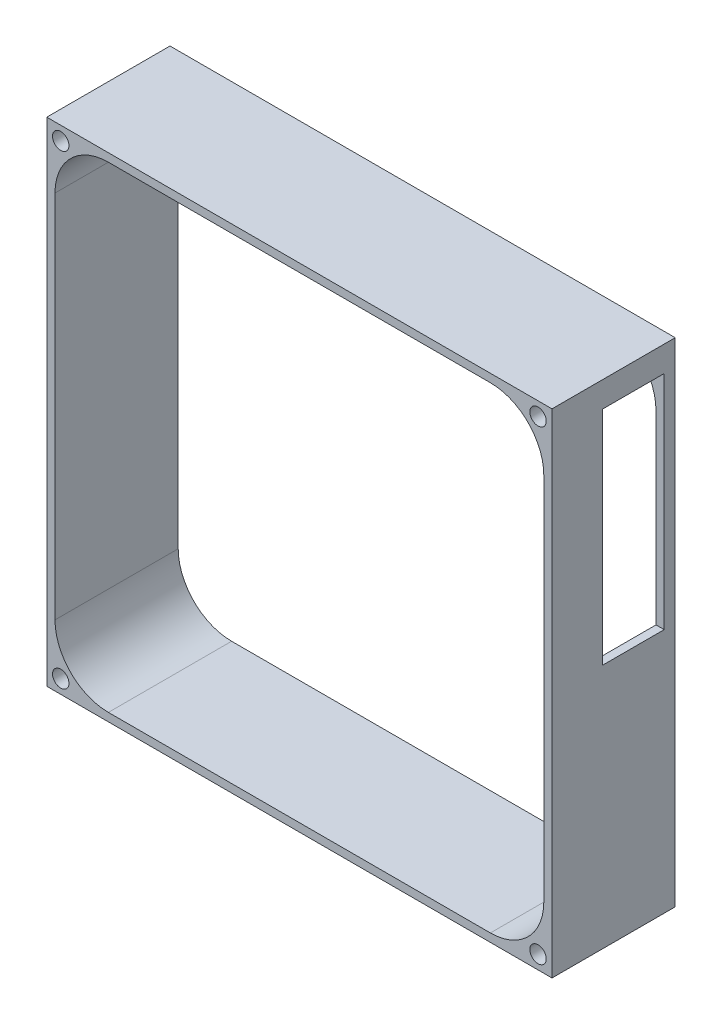
ISO-10303-21;
HEADER;
FILE_DESCRIPTION(('STEP AP214'),'2;1');
FILE_NAME('part.step','',(''),(''),'','','');
FILE_SCHEMA(('AUTOMOTIVE_DESIGN { 1 0 10303 214 1 1 1 1 }'));
ENDSEC;
DATA;
#1=APPLICATION_CONTEXT('core data for automotive mechanical design processes');
#2=APPLICATION_PROTOCOL_DEFINITION('international standard','automotive_design',2000,#1);
#3=PRODUCT_CONTEXT('',#1,'mechanical');
#4=PRODUCT('Part','Part','',(#3));
#5=PRODUCT_RELATED_PRODUCT_CATEGORY('part','',(#4));
#6=PRODUCT_DEFINITION_FORMATION('','',#4);
#7=PRODUCT_DEFINITION_CONTEXT('part definition',#1,'design');
#8=PRODUCT_DEFINITION('design','',#6,#7);
#9=PRODUCT_DEFINITION_SHAPE('','',#8);
#10=(LENGTH_UNIT() NAMED_UNIT(*) SI_UNIT(.MILLI.,.METRE.));
#11=(NAMED_UNIT(*) PLANE_ANGLE_UNIT() SI_UNIT($,.RADIAN.));
#12=(NAMED_UNIT(*) SI_UNIT($,.STERADIAN.) SOLID_ANGLE_UNIT());
#13=UNCERTAINTY_MEASURE_WITH_UNIT(LENGTH_MEASURE(1.E-05),#10,'distance_accuracy_value','');
#14=(GEOMETRIC_REPRESENTATION_CONTEXT(3) GLOBAL_UNCERTAINTY_ASSIGNED_CONTEXT((#13)) GLOBAL_UNIT_ASSIGNED_CONTEXT((#10,
#11,#12)) REPRESENTATION_CONTEXT('',''));
#15=CARTESIAN_POINT('',(0.,0.,0.));
#16=DIRECTION('',(0.,0.,1.));
#17=DIRECTION('',(1.,0.,0.));
#18=AXIS2_PLACEMENT_3D('',#15,#16,#17);
#19=CARTESIAN_POINT('',(0.,0.,30.));
#20=DIRECTION('',(0.,0.,1.));
#21=DIRECTION('',(1.,0.,0.));
#22=AXIS2_PLACEMENT_3D('',#19,#20,#21);
#23=PLANE('',#22);
#24=CARTESIAN_POINT('',(32.1945356443295,-3.47882005527365,30.));
#25=DIRECTION('',(0.,0.,1.));
#26=DIRECTION('',(1.,0.,0.));
#27=AXIS2_PLACEMENT_3D('',#24,#25,#26);
#28=CIRCLE('',#27,2.);
#29=CARTESIAN_POINT('',(34.1945356443295,-3.47882005527365,30.));
#30=VERTEX_POINT('',#29);
#31=EDGE_CURVE('E290',#30,#30,#28,.T.);
#32=ORIENTED_EDGE('',*,*,#31,.F.);
#33=EDGE_LOOP('',(#32));
#34=FACE_BOUND('',#33,.T.);
#35=CARTESIAN_POINT('',(-84.0083880507575,109.894431899334,30.));
#36=DIRECTION('',(0.,0.,1.));
#37=DIRECTION('',(1.,0.,0.));
#38=AXIS2_PLACEMENT_3D('',#35,#36,#37);
#39=CIRCLE('',#38,2.);
#40=CARTESIAN_POINT('',(-82.0083880507575,109.894431899334,30.));
#41=VERTEX_POINT('',#40);
#42=EDGE_CURVE('E302',#41,#41,#39,.T.);
#43=ORIENTED_EDGE('',*,*,#42,.F.);
#44=EDGE_LOOP('',(#43));
#45=FACE_BOUND('',#44,.T.);
#46=DIRECTION('',(0.,-1.,0.));
#47=VECTOR('',#46,1.);
#48=CARTESIAN_POINT('',(-87.406926203214,113.20780592203,30.));
#49=LINE('',#48,#47);
#50=CARTESIAN_POINT('',(-87.406926203214,113.20780592203,30.));
#51=VERTEX_POINT('',#50);
#52=CARTESIAN_POINT('',(-87.406926203214,-6.79219407796985,30.));
#53=VERTEX_POINT('',#52);
#54=EDGE_CURVE('E308',#51,#53,#49,.T.);
#55=ORIENTED_EDGE('',*,*,#54,.T.);
#56=DIRECTION('',(1.,0.,0.));
#57=VECTOR('',#56,1.);
#58=CARTESIAN_POINT('',(-87.406926203214,-6.79219407796985,30.));
#59=LINE('',#58,#57);
#60=CARTESIAN_POINT('',(35.593073796786,-6.79219407796985,30.));
#61=VERTEX_POINT('',#60);
#62=EDGE_CURVE('E311',#53,#61,#59,.T.);
#63=ORIENTED_EDGE('',*,*,#62,.T.);
#64=DIRECTION('',(0.,1.,0.));
#65=VECTOR('',#64,1.);
#66=CARTESIAN_POINT('',(35.593073796786,113.20780592203,30.));
#67=LINE('',#66,#65);
#68=CARTESIAN_POINT('',(35.593073796786,113.20780592203,30.));
#69=VERTEX_POINT('',#68);
#70=EDGE_CURVE('E314',#61,#69,#67,.T.);
#71=ORIENTED_EDGE('',*,*,#70,.T.);
#72=DIRECTION('',(-1.,0.,0.));
#73=VECTOR('',#72,1.);
#74=CARTESIAN_POINT('',(-87.406926203214,113.20780592203,30.));
#75=LINE('',#74,#73);
#76=EDGE_CURVE('E316',#69,#51,#75,.T.);
#77=ORIENTED_EDGE('',*,*,#76,.T.);
#78=EDGE_LOOP('',(#55,#63,#71,#77));
#79=FACE_BOUND('',#78,.T.);
#80=CARTESIAN_POINT('',(32.1945356443295,109.894431899334,30.));
#81=DIRECTION('',(0.,0.,1.));
#82=DIRECTION('',(-1.,0.,0.));
#83=AXIS2_PLACEMENT_3D('',#80,#81,#82);
#84=CIRCLE('',#83,2.);
#85=CARTESIAN_POINT('',(30.1945356443295,109.894431899334,30.));
#86=VERTEX_POINT('',#85);
#87=EDGE_CURVE('E296',#86,#86,#84,.T.);
#88=ORIENTED_EDGE('',*,*,#87,.F.);
#89=EDGE_LOOP('',(#88));
#90=FACE_BOUND('',#89,.T.);
#91=CARTESIAN_POINT('',(-84.0083880507575,-3.47882005527365,30.));
#92=DIRECTION('',(0.,0.,1.));
#93=DIRECTION('',(-1.,0.,0.));
#94=AXIS2_PLACEMENT_3D('',#91,#92,#93);
#95=CIRCLE('',#94,2.);
#96=CARTESIAN_POINT('',(-86.0083880507575,-3.47882005527365,30.));
#97=VERTEX_POINT('',#96);
#98=EDGE_CURVE('E284',#97,#97,#95,.T.);
#99=ORIENTED_EDGE('',*,*,#98,.F.);
#100=EDGE_LOOP('',(#99));
#101=FACE_BOUND('',#100,.T.);
#102=DIRECTION('',(1.,0.,0.));
#103=VECTOR('',#102,1.);
#104=CARTESIAN_POINT('',(-72.406926203214,-4.79219407796985,30.));
#105=LINE('',#104,#103);
#106=CARTESIAN_POINT('',(-72.406926203214,-4.79219407796985,30.));
#107=VERTEX_POINT('',#106);
#108=CARTESIAN_POINT('',(20.593073796786,-4.79219407796988,30.));
#109=VERTEX_POINT('',#108);
#110=EDGE_CURVE('E225',#107,#109,#105,.T.);
#111=ORIENTED_EDGE('',*,*,#110,.F.);
#112=CARTESIAN_POINT('',(-72.406926203214,8.20780592203015,30.));
#113=DIRECTION('',(0.,0.,1.));
#114=DIRECTION('',(1.,0.,0.));
#115=AXIS2_PLACEMENT_3D('',#112,#113,#114);
#116=CIRCLE('',#115,13.);
#117=CARTESIAN_POINT('',(-85.4069262032141,8.20780592203015,30.));
#118=VERTEX_POINT('',#117);
#119=EDGE_CURVE('E223',#118,#107,#116,.T.);
#120=ORIENTED_EDGE('',*,*,#119,.F.);
#121=DIRECTION('',(0.,-1.,0.));
#122=VECTOR('',#121,1.);
#123=CARTESIAN_POINT('',(-85.4069262032141,98.2078059220301,30.));
#124=LINE('',#123,#122);
#125=CARTESIAN_POINT('',(-85.4069262032141,98.2078059220301,30.));
#126=VERTEX_POINT('',#125);
#127=EDGE_CURVE('E239',#126,#118,#124,.T.);
#128=ORIENTED_EDGE('',*,*,#127,.F.);
#129=CARTESIAN_POINT('',(-72.406926203214,98.2078059220301,30.));
#130=DIRECTION('',(0.,0.,1.));
#131=DIRECTION('',(1.,0.,0.));
#132=AXIS2_PLACEMENT_3D('',#129,#130,#131);
#133=CIRCLE('',#132,13.);
#134=CARTESIAN_POINT('',(-72.406926203214,111.20780592203,30.));
#135=VERTEX_POINT('',#134);
#136=EDGE_CURVE('E236',#135,#126,#133,.T.);
#137=ORIENTED_EDGE('',*,*,#136,.F.);
#138=DIRECTION('',(-1.,0.,0.));
#139=VECTOR('',#138,1.);
#140=CARTESIAN_POINT('',(-72.406926203214,111.20780592203,30.));
#141=LINE('',#140,#139);
#142=CARTESIAN_POINT('',(20.593073796786,111.20780592203,30.));
#143=VERTEX_POINT('',#142);
#144=EDGE_CURVE('E234',#143,#135,#141,.T.);
#145=ORIENTED_EDGE('',*,*,#144,.F.);
#146=CARTESIAN_POINT('',(20.593073796786,98.2078059220301,30.));
#147=DIRECTION('',(0.,0.,1.));
#148=DIRECTION('',(1.,0.,0.));
#149=AXIS2_PLACEMENT_3D('',#146,#147,#148);
#150=CIRCLE('',#149,13.);
#151=CARTESIAN_POINT('',(33.593073796786,98.2078059220301,30.));
#152=VERTEX_POINT('',#151);
#153=EDGE_CURVE('E232',#152,#143,#150,.T.);
#154=ORIENTED_EDGE('',*,*,#153,.F.);
#155=DIRECTION('',(0.,1.,0.));
#156=VECTOR('',#155,1.);
#157=CARTESIAN_POINT('',(33.5930737967861,98.2078059220301,30.));
#158=LINE('',#157,#156);
#159=CARTESIAN_POINT('',(33.5930737967861,8.20780592203015,30.));
#160=VERTEX_POINT('',#159);
#161=EDGE_CURVE('E230',#160,#152,#158,.T.);
#162=ORIENTED_EDGE('',*,*,#161,.F.);
#163=CARTESIAN_POINT('',(20.593073796786,8.20780592203015,30.));
#164=DIRECTION('',(0.,0.,1.));
#165=DIRECTION('',(1.,0.,0.));
#166=AXIS2_PLACEMENT_3D('',#163,#164,#165);
#167=CIRCLE('',#166,13.);
#168=EDGE_CURVE('E228',#109,#160,#167,.T.);
#169=ORIENTED_EDGE('',*,*,#168,.F.);
#170=EDGE_LOOP('',(#111,#120,#128,#137,#145,#154,#162,#169));
#171=FACE_BOUND('',#170,.T.);
#172=ADVANCED_FACE('F35',(#34,#45,#79,#90,#101,#171),#23,.T.);
#173=CARTESIAN_POINT('',(0.,0.,0.));
#174=DIRECTION('',(0.,0.,1.));
#175=DIRECTION('',(1.,0.,0.));
#176=AXIS2_PLACEMENT_3D('',#173,#174,#175);
#177=PLANE('',#176);
#178=CARTESIAN_POINT('',(-84.0083880507575,-3.47882005527365,0.));
#179=DIRECTION('',(0.,0.,1.));
#180=DIRECTION('',(-1.,0.,0.));
#181=AXIS2_PLACEMENT_3D('',#178,#179,#180);
#182=CIRCLE('',#181,2.);
#183=CARTESIAN_POINT('',(-86.0083880507575,-3.47882005527365,0.));
#184=VERTEX_POINT('',#183);
#185=EDGE_CURVE('E283',#184,#184,#182,.T.);
#186=ORIENTED_EDGE('',*,*,#185,.T.);
#187=EDGE_LOOP('',(#186));
#188=FACE_BOUND('',#187,.T.);
#189=CARTESIAN_POINT('',(32.1945356443295,-3.47882005527365,0.));
#190=DIRECTION('',(0.,0.,1.));
#191=DIRECTION('',(1.,0.,0.));
#192=AXIS2_PLACEMENT_3D('',#189,#190,#191);
#193=CIRCLE('',#192,2.);
#194=CARTESIAN_POINT('',(34.1945356443295,-3.47882005527365,0.));
#195=VERTEX_POINT('',#194);
#196=EDGE_CURVE('E287',#195,#195,#193,.T.);
#197=ORIENTED_EDGE('',*,*,#196,.T.);
#198=EDGE_LOOP('',(#197));
#199=FACE_BOUND('',#198,.T.);
#200=CARTESIAN_POINT('',(32.1945356443295,109.894431899334,0.));
#201=DIRECTION('',(0.,0.,1.));
#202=DIRECTION('',(-1.,0.,0.));
#203=AXIS2_PLACEMENT_3D('',#200,#201,#202);
#204=CIRCLE('',#203,2.);
#205=CARTESIAN_POINT('',(30.1945356443295,109.894431899334,0.));
#206=VERTEX_POINT('',#205);
#207=EDGE_CURVE('E293',#206,#206,#204,.T.);
#208=ORIENTED_EDGE('',*,*,#207,.T.);
#209=EDGE_LOOP('',(#208));
#210=FACE_BOUND('',#209,.T.);
#211=CARTESIAN_POINT('',(-84.0083880507575,109.894431899334,0.));
#212=DIRECTION('',(0.,0.,1.));
#213=DIRECTION('',(1.,0.,0.));
#214=AXIS2_PLACEMENT_3D('',#211,#212,#213);
#215=CIRCLE('',#214,2.);
#216=CARTESIAN_POINT('',(-82.0083880507575,109.894431899334,0.));
#217=VERTEX_POINT('',#216);
#218=EDGE_CURVE('E299',#217,#217,#215,.T.);
#219=ORIENTED_EDGE('',*,*,#218,.T.);
#220=EDGE_LOOP('',(#219));
#221=FACE_BOUND('',#220,.T.);
#222=DIRECTION('',(0.,-1.,0.));
#223=VECTOR('',#222,1.);
#224=CARTESIAN_POINT('',(-87.406926203214,113.20780592203,0.));
#225=LINE('',#224,#223);
#226=CARTESIAN_POINT('',(-87.406926203214,113.20780592203,0.));
#227=VERTEX_POINT('',#226);
#228=CARTESIAN_POINT('',(-87.406926203214,-6.79219407796985,0.));
#229=VERTEX_POINT('',#228);
#230=EDGE_CURVE('E305',#227,#229,#225,.T.);
#231=ORIENTED_EDGE('',*,*,#230,.F.);
#232=DIRECTION('',(-1.,0.,0.));
#233=VECTOR('',#232,1.);
#234=CARTESIAN_POINT('',(-87.406926203214,113.20780592203,0.));
#235=LINE('',#234,#233);
#236=CARTESIAN_POINT('',(35.593073796786,113.20780592203,0.));
#237=VERTEX_POINT('',#236);
#238=EDGE_CURVE('E312',#237,#227,#235,.T.);
#239=ORIENTED_EDGE('',*,*,#238,.F.);
#240=DIRECTION('',(0.,1.,0.));
#241=VECTOR('',#240,1.);
#242=CARTESIAN_POINT('',(35.593073796786,113.20780592203,0.));
#243=LINE('',#242,#241);
#244=CARTESIAN_POINT('',(35.593073796786,-6.79219407796985,0.));
#245=VERTEX_POINT('',#244);
#246=EDGE_CURVE('E323',#245,#237,#243,.T.);
#247=ORIENTED_EDGE('',*,*,#246,.F.);
#248=DIRECTION('',(1.,0.,0.));
#249=VECTOR('',#248,1.);
#250=CARTESIAN_POINT('',(-87.406926203214,-6.79219407796985,0.));
#251=LINE('',#250,#249);
#252=EDGE_CURVE('E321',#229,#245,#251,.T.);
#253=ORIENTED_EDGE('',*,*,#252,.F.);
#254=EDGE_LOOP('',(#231,#239,#247,#253));
#255=FACE_BOUND('',#254,.T.);
#256=CARTESIAN_POINT('',(-72.406926203214,8.20780592203015,0.));
#257=DIRECTION('',(0.,0.,1.));
#258=DIRECTION('',(1.,0.,0.));
#259=AXIS2_PLACEMENT_3D('',#256,#257,#258);
#260=CIRCLE('',#259,13.);
#261=CARTESIAN_POINT('',(-85.4069262032141,8.20780592203015,0.));
#262=VERTEX_POINT('',#261);
#263=CARTESIAN_POINT('',(-72.406926203214,-4.79219407796985,0.));
#264=VERTEX_POINT('',#263);
#265=EDGE_CURVE('E222',#262,#264,#260,.T.);
#266=ORIENTED_EDGE('',*,*,#265,.T.);
#267=DIRECTION('',(1.,0.,0.));
#268=VECTOR('',#267,1.);
#269=CARTESIAN_POINT('',(-72.406926203214,-4.79219407796985,0.));
#270=LINE('',#269,#268);
#271=CARTESIAN_POINT('',(20.593073796786,-4.79219407796988,0.));
#272=VERTEX_POINT('',#271);
#273=EDGE_CURVE('E244',#264,#272,#270,.T.);
#274=ORIENTED_EDGE('',*,*,#273,.T.);
#275=CARTESIAN_POINT('',(20.593073796786,8.20780592203015,0.));
#276=DIRECTION('',(0.,0.,1.));
#277=DIRECTION('',(1.,0.,0.));
#278=AXIS2_PLACEMENT_3D('',#275,#276,#277);
#279=CIRCLE('',#278,13.);
#280=CARTESIAN_POINT('',(33.5930737967861,8.20780592203015,0.));
#281=VERTEX_POINT('',#280);
#282=EDGE_CURVE('E247',#272,#281,#279,.T.);
#283=ORIENTED_EDGE('',*,*,#282,.T.);
#284=DIRECTION('',(0.,1.,0.));
#285=VECTOR('',#284,1.);
#286=CARTESIAN_POINT('',(33.5930737967861,98.2078059220301,0.));
#287=LINE('',#286,#285);
#288=CARTESIAN_POINT('',(33.593073796786,98.2078059220301,0.));
#289=VERTEX_POINT('',#288);
#290=EDGE_CURVE('E250',#281,#289,#287,.T.);
#291=ORIENTED_EDGE('',*,*,#290,.T.);
#292=CARTESIAN_POINT('',(20.593073796786,98.2078059220301,0.));
#293=DIRECTION('',(0.,0.,1.));
#294=DIRECTION('',(1.,0.,0.));
#295=AXIS2_PLACEMENT_3D('',#292,#293,#294);
#296=CIRCLE('',#295,13.);
#297=CARTESIAN_POINT('',(20.593073796786,111.20780592203,0.));
#298=VERTEX_POINT('',#297);
#299=EDGE_CURVE('E253',#289,#298,#296,.T.);
#300=ORIENTED_EDGE('',*,*,#299,.T.);
#301=DIRECTION('',(-1.,0.,0.));
#302=VECTOR('',#301,1.);
#303=CARTESIAN_POINT('',(-72.406926203214,111.20780592203,0.));
#304=LINE('',#303,#302);
#305=CARTESIAN_POINT('',(-72.406926203214,111.20780592203,0.));
#306=VERTEX_POINT('',#305);
#307=EDGE_CURVE('E256',#298,#306,#304,.T.);
#308=ORIENTED_EDGE('',*,*,#307,.T.);
#309=CARTESIAN_POINT('',(-72.406926203214,98.2078059220301,0.));
#310=DIRECTION('',(0.,0.,1.));
#311=DIRECTION('',(1.,0.,0.));
#312=AXIS2_PLACEMENT_3D('',#309,#310,#311);
#313=CIRCLE('',#312,13.);
#314=CARTESIAN_POINT('',(-85.4069262032141,98.2078059220301,0.));
#315=VERTEX_POINT('',#314);
#316=EDGE_CURVE('E259',#306,#315,#313,.T.);
#317=ORIENTED_EDGE('',*,*,#316,.T.);
#318=DIRECTION('',(0.,-1.,0.));
#319=VECTOR('',#318,1.);
#320=CARTESIAN_POINT('',(-85.4069262032141,98.2078059220301,0.));
#321=LINE('',#320,#319);
#322=EDGE_CURVE('E226',#315,#262,#321,.T.);
#323=ORIENTED_EDGE('',*,*,#322,.T.);
#324=EDGE_LOOP('',(#266,#274,#283,#291,#300,#308,#317,#323));
#325=FACE_BOUND('',#324,.T.);
#326=ADVANCED_FACE('F357',(#188,#199,#210,#221,#255,#325),#177,.F.);
#327=CARTESIAN_POINT('',(-87.406926203214,113.20780592203,30.));
#328=DIRECTION('',(1.,0.,0.));
#329=DIRECTION('',(0.,0.,-1.));
#330=AXIS2_PLACEMENT_3D('',#327,#328,#329);
#331=PLANE('',#330);
#332=ORIENTED_EDGE('',*,*,#230,.T.);
#333=DIRECTION('',(0.,0.,-1.));
#334=VECTOR('',#333,1.);
#335=CARTESIAN_POINT('',(-87.406926203214,-6.79219407796985,30.));
#336=LINE('',#335,#334);
#337=EDGE_CURVE('E334',#53,#229,#336,.T.);
#338=ORIENTED_EDGE('',*,*,#337,.F.);
#339=ORIENTED_EDGE('',*,*,#54,.F.);
#340=DIRECTION('',(0.,0.,-1.));
#341=VECTOR('',#340,1.);
#342=CARTESIAN_POINT('',(-87.406926203214,113.20780592203,30.));
#343=LINE('',#342,#341);
#344=EDGE_CURVE('E318',#51,#227,#343,.T.);
#345=ORIENTED_EDGE('',*,*,#344,.T.);
#346=EDGE_LOOP('',(#332,#338,#339,#345));
#347=FACE_BOUND('',#346,.T.);
#348=ADVANCED_FACE('F37',(#347),#331,.F.);
#349=CARTESIAN_POINT('',(-87.406926203214,-6.79219407796985,30.));
#350=DIRECTION('',(0.,1.,0.));
#351=DIRECTION('',(0.,0.,1.));
#352=AXIS2_PLACEMENT_3D('',#349,#350,#351);
#353=PLANE('',#352);
#354=ORIENTED_EDGE('',*,*,#252,.T.);
#355=DIRECTION('',(0.,0.,-1.));
#356=VECTOR('',#355,1.);
#357=CARTESIAN_POINT('',(35.593073796786,-6.79219407796985,30.));
#358=LINE('',#357,#356);
#359=EDGE_CURVE('E331',#61,#245,#358,.T.);
#360=ORIENTED_EDGE('',*,*,#359,.F.);
#361=ORIENTED_EDGE('',*,*,#62,.F.);
#362=ORIENTED_EDGE('',*,*,#337,.T.);
#363=EDGE_LOOP('',(#354,#360,#361,#362));
#364=FACE_BOUND('',#363,.T.);
#365=ADVANCED_FACE('F437',(#364),#353,.F.);
#366=CARTESIAN_POINT('',(35.593073796786,113.20780592203,30.));
#367=DIRECTION('',(-1.,0.,0.));
#368=DIRECTION('',(0.,-1.,0.));
#369=AXIS2_PLACEMENT_3D('',#366,#367,#368);
#370=PLANE('',#369);
#371=DIRECTION('',(0.,0.,-1.));
#372=VECTOR('',#371,1.);
#373=CARTESIAN_POINT('',(35.593073796786,52.9993054888305,17.6862832316964));
#374=LINE('',#373,#372);
#375=CARTESIAN_POINT('',(35.593073796786,52.9993054888305,17.6862832316964));
#376=VERTEX_POINT('',#375);
#377=CARTESIAN_POINT('',(35.593073796786,52.9993054888305,2.68628323169639));
#378=VERTEX_POINT('',#377);
#379=EDGE_CURVE('E202',#376,#378,#374,.T.);
#380=ORIENTED_EDGE('',*,*,#379,.F.);
#381=DIRECTION('',(0.,-1.,0.));
#382=VECTOR('',#381,1.);
#383=CARTESIAN_POINT('',(35.593073796786,106.99930548883,17.6862832316964));
#384=LINE('',#383,#382);
#385=CARTESIAN_POINT('',(35.593073796786,106.99930548883,17.6862832316964));
#386=VERTEX_POINT('',#385);
#387=EDGE_CURVE('E50',#386,#376,#384,.T.);
#388=ORIENTED_EDGE('',*,*,#387,.F.);
#389=DIRECTION('',(0.,0.,1.));
#390=VECTOR('',#389,1.);
#391=CARTESIAN_POINT('',(35.593073796786,106.99930548883,17.6862832316964));
#392=LINE('',#391,#390);
#393=CARTESIAN_POINT('',(35.593073796786,106.99930548883,2.68628323169639));
#394=VERTEX_POINT('',#393);
#395=EDGE_CURVE('E207',#394,#386,#392,.T.);
#396=ORIENTED_EDGE('',*,*,#395,.F.);
#397=DIRECTION('',(0.,1.,0.));
#398=VECTOR('',#397,1.);
#399=CARTESIAN_POINT('',(35.593073796786,106.99930548883,2.68628323169639));
#400=LINE('',#399,#398);
#401=EDGE_CURVE('E205',#378,#394,#400,.T.);
#402=ORIENTED_EDGE('',*,*,#401,.F.);
#403=EDGE_LOOP('',(#380,#388,#396,#402));
#404=FACE_BOUND('',#403,.T.);
#405=ORIENTED_EDGE('',*,*,#246,.T.);
#406=DIRECTION('',(0.,0.,-1.));
#407=VECTOR('',#406,1.);
#408=CARTESIAN_POINT('',(35.593073796786,113.20780592203,30.));
#409=LINE('',#408,#407);
#410=EDGE_CURVE('E328',#69,#237,#409,.T.);
#411=ORIENTED_EDGE('',*,*,#410,.F.);
#412=ORIENTED_EDGE('',*,*,#70,.F.);
#413=ORIENTED_EDGE('',*,*,#359,.T.);
#414=EDGE_LOOP('',(#405,#411,#412,#413));
#415=FACE_BOUND('',#414,.T.);
#416=ADVANCED_FACE('F402',(#404,#415),#370,.F.);
#417=CARTESIAN_POINT('',(-87.406926203214,113.20780592203,30.));
#418=DIRECTION('',(0.,-1.,0.));
#419=DIRECTION('',(0.,0.,-1.));
#420=AXIS2_PLACEMENT_3D('',#417,#418,#419);
#421=PLANE('',#420);
#422=ORIENTED_EDGE('',*,*,#238,.T.);
#423=ORIENTED_EDGE('',*,*,#344,.F.);
#424=ORIENTED_EDGE('',*,*,#76,.F.);
#425=ORIENTED_EDGE('',*,*,#410,.T.);
#426=EDGE_LOOP('',(#422,#423,#424,#425));
#427=FACE_BOUND('',#426,.T.);
#428=ADVANCED_FACE('F432',(#427),#421,.F.);
#429=CARTESIAN_POINT('',(-84.0083880507575,109.894431899334,30.));
#430=DIRECTION('',(0.,0.,-1.));
#431=DIRECTION('',(-1.,0.,0.));
#432=AXIS2_PLACEMENT_3D('',#429,#430,#431);
#433=CYLINDRICAL_SURFACE('',#432,2.);
#434=ORIENTED_EDGE('',*,*,#42,.T.);
#435=EDGE_LOOP('',(#434));
#436=FACE_BOUND('',#435,.T.);
#437=ORIENTED_EDGE('',*,*,#218,.F.);
#438=EDGE_LOOP('',(#437));
#439=FACE_BOUND('',#438,.T.);
#440=ADVANCED_FACE('F429',(#436,#439),#433,.F.);
#441=CARTESIAN_POINT('',(32.1945356443295,109.894431899334,30.));
#442=DIRECTION('',(0.,0.,-1.));
#443=DIRECTION('',(-1.,0.,0.));
#444=AXIS2_PLACEMENT_3D('',#441,#442,#443);
#445=CYLINDRICAL_SURFACE('',#444,2.);
#446=ORIENTED_EDGE('',*,*,#87,.T.);
#447=EDGE_LOOP('',(#446));
#448=FACE_BOUND('',#447,.T.);
#449=ORIENTED_EDGE('',*,*,#207,.F.);
#450=EDGE_LOOP('',(#449));
#451=FACE_BOUND('',#450,.T.);
#452=ADVANCED_FACE('F475',(#448,#451),#445,.F.);
#453=CARTESIAN_POINT('',(32.1945356443295,-3.47882005527365,30.));
#454=DIRECTION('',(0.,0.,-1.));
#455=DIRECTION('',(-1.,0.,0.));
#456=AXIS2_PLACEMENT_3D('',#453,#454,#455);
#457=CYLINDRICAL_SURFACE('',#456,2.);
#458=ORIENTED_EDGE('',*,*,#31,.T.);
#459=EDGE_LOOP('',(#458));
#460=FACE_BOUND('',#459,.T.);
#461=ORIENTED_EDGE('',*,*,#196,.F.);
#462=EDGE_LOOP('',(#461));
#463=FACE_BOUND('',#462,.T.);
#464=ADVANCED_FACE('F464',(#460,#463),#457,.F.);
#465=CARTESIAN_POINT('',(-84.0083880507575,-3.47882005527365,30.));
#466=DIRECTION('',(0.,0.,-1.));
#467=DIRECTION('',(-1.,0.,0.));
#468=AXIS2_PLACEMENT_3D('',#465,#466,#467);
#469=CYLINDRICAL_SURFACE('',#468,2.);
#470=ORIENTED_EDGE('',*,*,#98,.T.);
#471=EDGE_LOOP('',(#470));
#472=FACE_BOUND('',#471,.T.);
#473=ORIENTED_EDGE('',*,*,#185,.F.);
#474=EDGE_LOOP('',(#473));
#475=FACE_BOUND('',#474,.T.);
#476=ADVANCED_FACE('F461',(#472,#475),#469,.F.);
#477=CARTESIAN_POINT('',(-72.406926203214,8.20780592203015,30.));
#478=DIRECTION('',(0.,0.,-1.));
#479=DIRECTION('',(-1.,0.,0.));
#480=AXIS2_PLACEMENT_3D('',#477,#478,#479);
#481=CYLINDRICAL_SURFACE('',#480,13.);
#482=ORIENTED_EDGE('',*,*,#265,.F.);
#483=DIRECTION('',(0.,0.,-1.));
#484=VECTOR('',#483,1.);
#485=CARTESIAN_POINT('',(-85.4069262032141,8.20780592203015,30.));
#486=LINE('',#485,#484);
#487=EDGE_CURVE('E241',#118,#262,#486,.T.);
#488=ORIENTED_EDGE('',*,*,#487,.F.);
#489=ORIENTED_EDGE('',*,*,#119,.T.);
#490=DIRECTION('',(0.,0.,-1.));
#491=VECTOR('',#490,1.);
#492=CARTESIAN_POINT('',(-72.406926203214,-4.79219407796985,30.));
#493=LINE('',#492,#491);
#494=EDGE_CURVE('E280',#107,#264,#493,.T.);
#495=ORIENTED_EDGE('',*,*,#494,.T.);
#496=EDGE_LOOP('',(#482,#488,#489,#495));
#497=FACE_BOUND('',#496,.T.);
#498=ADVANCED_FACE('F371',(#497),#481,.F.);
#499=CARTESIAN_POINT('',(-72.406926203214,-4.79219407796985,30.));
#500=DIRECTION('',(0.,1.,0.));
#501=DIRECTION('',(0.,0.,1.));
#502=AXIS2_PLACEMENT_3D('',#499,#500,#501);
#503=PLANE('',#502);
#504=ORIENTED_EDGE('',*,*,#273,.F.);
#505=ORIENTED_EDGE('',*,*,#494,.F.);
#506=ORIENTED_EDGE('',*,*,#110,.T.);
#507=DIRECTION('',(0.,0.,-1.));
#508=VECTOR('',#507,1.);
#509=CARTESIAN_POINT('',(20.593073796786,-4.79219407796988,30.));
#510=LINE('',#509,#508);
#511=EDGE_CURVE('E278',#109,#272,#510,.T.);
#512=ORIENTED_EDGE('',*,*,#511,.T.);
#513=EDGE_LOOP('',(#504,#505,#506,#512));
#514=FACE_BOUND('',#513,.T.);
#515=ADVANCED_FACE('F375',(#514),#503,.T.);
#516=CARTESIAN_POINT('',(20.593073796786,8.20780592203015,30.));
#517=DIRECTION('',(0.,0.,-1.));
#518=DIRECTION('',(-1.,0.,0.));
#519=AXIS2_PLACEMENT_3D('',#516,#517,#518);
#520=CYLINDRICAL_SURFACE('',#519,13.);
#521=ORIENTED_EDGE('',*,*,#282,.F.);
#522=ORIENTED_EDGE('',*,*,#511,.F.);
#523=ORIENTED_EDGE('',*,*,#168,.T.);
#524=DIRECTION('',(0.,0.,-1.));
#525=VECTOR('',#524,1.);
#526=CARTESIAN_POINT('',(33.5930737967861,8.20780592203015,30.));
#527=LINE('',#526,#525);
#528=EDGE_CURVE('E276',#160,#281,#527,.T.);
#529=ORIENTED_EDGE('',*,*,#528,.T.);
#530=EDGE_LOOP('',(#521,#522,#523,#529));
#531=FACE_BOUND('',#530,.T.);
#532=ADVANCED_FACE('F379',(#531),#520,.F.);
#533=CARTESIAN_POINT('',(33.5930737967861,98.2078059220301,30.));
#534=DIRECTION('',(-1.,0.,0.));
#535=DIRECTION('',(0.,0.,1.));
#536=AXIS2_PLACEMENT_3D('',#533,#534,#535);
#537=PLANE('',#536);
#538=DIRECTION('',(0.,1.,0.));
#539=VECTOR('',#538,1.);
#540=CARTESIAN_POINT('',(33.5930737967861,98.2078059220301,17.6862832316964));
#541=LINE('',#540,#539);
#542=CARTESIAN_POINT('',(33.5930737967861,52.9993054888305,17.6862832316964));
#543=VERTEX_POINT('',#542);
#544=CARTESIAN_POINT('',(33.593073796786,98.2078059220301,17.6862832316964));
#545=VERTEX_POINT('',#544);
#546=EDGE_CURVE('E220',#543,#545,#541,.T.);
#547=ORIENTED_EDGE('',*,*,#546,.F.);
#548=DIRECTION('',(0.,0.,1.));
#549=VECTOR('',#548,1.);
#550=CARTESIAN_POINT('',(33.5930737967861,52.9993054888305,30.));
#551=LINE('',#550,#549);
#552=CARTESIAN_POINT('',(33.5930737967861,52.9993054888305,2.68628323169639));
#553=VERTEX_POINT('',#552);
#554=EDGE_CURVE('E11',#553,#543,#551,.T.);
#555=ORIENTED_EDGE('',*,*,#554,.F.);
#556=DIRECTION('',(0.,-1.,0.));
#557=VECTOR('',#556,1.);
#558=CARTESIAN_POINT('',(33.5930737967861,98.2078059220301,2.68628323169639));
#559=LINE('',#558,#557);
#560=CARTESIAN_POINT('',(33.593073796786,98.2078059220301,2.68628323169639));
#561=VERTEX_POINT('',#560);
#562=EDGE_CURVE('E214',#561,#553,#559,.T.);
#563=ORIENTED_EDGE('',*,*,#562,.F.);
#564=DIRECTION('',(0.,0.,-1.));
#565=VECTOR('',#564,1.);
#566=CARTESIAN_POINT('',(33.593073796786,98.2078059220301,30.));
#567=LINE('',#566,#565);
#568=EDGE_CURVE('E272',#561,#289,#567,.T.);
#569=ORIENTED_EDGE('',*,*,#568,.T.);
#570=ORIENTED_EDGE('',*,*,#290,.F.);
#571=ORIENTED_EDGE('',*,*,#528,.F.);
#572=ORIENTED_EDGE('',*,*,#161,.T.);
#573=EDGE_CURVE('E273',#152,#545,#567,.T.);
#574=ORIENTED_EDGE('',*,*,#573,.T.);
#575=EDGE_LOOP('',(#547,#555,#563,#569,#570,#571,#572,#574));
#576=FACE_BOUND('',#575,.T.);
#577=ADVANCED_FACE('F384',(#576),#537,.T.);
#578=CARTESIAN_POINT('',(20.593073796786,98.2078059220301,30.));
#579=DIRECTION('',(0.,0.,-1.));
#580=DIRECTION('',(-1.,0.,0.));
#581=AXIS2_PLACEMENT_3D('',#578,#579,#580);
#582=CYLINDRICAL_SURFACE('',#581,13.);
#583=CARTESIAN_POINT('',(20.593073796786,98.2078059220301,17.6862832316964));
#584=DIRECTION('',(0.,0.,1.));
#585=DIRECTION('',(0.,-1.,0.));
#586=AXIS2_PLACEMENT_3D('',#583,#584,#585);
#587=CIRCLE('',#586,13.);
#588=CARTESIAN_POINT('',(30.1695833575263,106.99930548883,17.6862832316964));
#589=VERTEX_POINT('',#588);
#590=EDGE_CURVE('E218',#545,#589,#587,.T.);
#591=ORIENTED_EDGE('',*,*,#590,.F.);
#592=ORIENTED_EDGE('',*,*,#573,.F.);
#593=ORIENTED_EDGE('',*,*,#153,.T.);
#594=DIRECTION('',(0.,0.,-1.));
#595=VECTOR('',#594,1.);
#596=CARTESIAN_POINT('',(20.593073796786,111.20780592203,30.));
#597=LINE('',#596,#595);
#598=EDGE_CURVE('E270',#143,#298,#597,.T.);
#599=ORIENTED_EDGE('',*,*,#598,.T.);
#600=ORIENTED_EDGE('',*,*,#299,.F.);
#601=ORIENTED_EDGE('',*,*,#568,.F.);
#602=CARTESIAN_POINT('',(20.593073796786,98.2078059220301,2.68628323169639));
#603=DIRECTION('',(0.,0.,-1.));
#604=DIRECTION('',(-1.,0.,0.));
#605=AXIS2_PLACEMENT_3D('',#602,#603,#604);
#606=CIRCLE('',#605,13.);
#607=CARTESIAN_POINT('',(30.1695833575263,106.99930548883,2.68628323169639));
#608=VERTEX_POINT('',#607);
#609=EDGE_CURVE('E210',#608,#561,#606,.T.);
#610=ORIENTED_EDGE('',*,*,#609,.F.);
#611=DIRECTION('',(0.,0.,-1.));
#612=VECTOR('',#611,1.);
#613=CARTESIAN_POINT('',(30.1695833575263,106.99930548883,30.));
#614=LINE('',#613,#612);
#615=EDGE_CURVE('E216',#589,#608,#614,.T.);
#616=ORIENTED_EDGE('',*,*,#615,.F.);
#617=EDGE_LOOP('',(#591,#592,#593,#599,#600,#601,#610,#616));
#618=FACE_BOUND('',#617,.T.);
#619=ADVANCED_FACE('F391',(#618),#582,.F.);
#620=CARTESIAN_POINT('',(-72.406926203214,111.20780592203,30.));
#621=DIRECTION('',(0.,-1.,0.));
#622=DIRECTION('',(0.,0.,-1.));
#623=AXIS2_PLACEMENT_3D('',#620,#621,#622);
#624=PLANE('',#623);
#625=ORIENTED_EDGE('',*,*,#307,.F.);
#626=ORIENTED_EDGE('',*,*,#598,.F.);
#627=ORIENTED_EDGE('',*,*,#144,.T.);
#628=DIRECTION('',(0.,0.,-1.));
#629=VECTOR('',#628,1.);
#630=CARTESIAN_POINT('',(-72.406926203214,111.20780592203,30.));
#631=LINE('',#630,#629);
#632=EDGE_CURVE('E268',#135,#306,#631,.T.);
#633=ORIENTED_EDGE('',*,*,#632,.T.);
#634=EDGE_LOOP('',(#625,#626,#627,#633));
#635=FACE_BOUND('',#634,.T.);
#636=ADVANCED_FACE('F349',(#635),#624,.T.);
#637=CARTESIAN_POINT('',(-72.406926203214,98.2078059220301,30.));
#638=DIRECTION('',(0.,0.,-1.));
#639=DIRECTION('',(-1.,0.,0.));
#640=AXIS2_PLACEMENT_3D('',#637,#638,#639);
#641=CYLINDRICAL_SURFACE('',#640,13.);
#642=CARTESIAN_POINT('',(-72.406926203214,98.2078059220301,17.6862832316964));
#643=DIRECTION('',(0.,0.,1.));
#644=DIRECTION('',(0.,-1.,0.));
#645=AXIS2_PLACEMENT_3D('',#642,#643,#644);
#646=CIRCLE('',#645,13.);
#647=CARTESIAN_POINT('',(-81.9834357639543,106.99930548883,17.6862832316964));
#648=VERTEX_POINT('',#647);
#649=CARTESIAN_POINT('',(-84.406926203214,103.20780592203,17.6862832316964));
#650=VERTEX_POINT('',#649);
#651=EDGE_CURVE('E43',#648,#650,#646,.T.);
#652=ORIENTED_EDGE('',*,*,#651,.F.);
#653=DIRECTION('',(0.,0.,-1.));
#654=VECTOR('',#653,1.);
#655=CARTESIAN_POINT('',(-81.9834357639543,106.99930548883,30.));
#656=LINE('',#655,#654);
#657=CARTESIAN_POINT('',(-81.9834357639543,106.99930548883,2.68628323169639));
#658=VERTEX_POINT('',#657);
#659=EDGE_CURVE('E339',#658,#648,#656,.F.);
#660=ORIENTED_EDGE('',*,*,#659,.F.);
#661=CARTESIAN_POINT('',(-72.406926203214,98.2078059220301,2.68628323169639));
#662=DIRECTION('',(0.,0.,-1.));
#663=DIRECTION('',(-1.,0.,0.));
#664=AXIS2_PLACEMENT_3D('',#661,#662,#663);
#665=CIRCLE('',#664,13.);
#666=CARTESIAN_POINT('',(-84.406926203214,103.20780592203,2.68628323169639));
#667=VERTEX_POINT('',#666);
#668=EDGE_CURVE('E186',#667,#658,#665,.T.);
#669=ORIENTED_EDGE('',*,*,#668,.F.);
#670=DIRECTION('',(0.,0.,-1.));
#671=VECTOR('',#670,1.);
#672=CARTESIAN_POINT('',(-84.406926203214,103.20780592203,30.));
#673=LINE('',#672,#671);
#674=EDGE_CURVE('E178',#667,#650,#673,.F.);
#675=ORIENTED_EDGE('',*,*,#674,.T.);
#676=EDGE_LOOP('',(#652,#660,#669,#675));
#677=FACE_BOUND('',#676,.T.);
#678=ORIENTED_EDGE('',*,*,#316,.F.);
#679=ORIENTED_EDGE('',*,*,#632,.F.);
#680=ORIENTED_EDGE('',*,*,#136,.T.);
#681=DIRECTION('',(0.,0.,-1.));
#682=VECTOR('',#681,1.);
#683=CARTESIAN_POINT('',(-85.4069262032141,98.2078059220301,30.));
#684=LINE('',#683,#682);
#685=EDGE_CURVE('E266',#126,#315,#684,.T.);
#686=ORIENTED_EDGE('',*,*,#685,.T.);
#687=EDGE_LOOP('',(#678,#679,#680,#686));
#688=FACE_BOUND('',#687,.T.);
#689=ADVANCED_FACE('F345',(#677,#688),#641,.F.);
#690=CARTESIAN_POINT('',(-85.4069262032141,98.2078059220301,30.));
#691=DIRECTION('',(1.,0.,0.));
#692=DIRECTION('',(0.,0.,-1.));
#693=AXIS2_PLACEMENT_3D('',#690,#691,#692);
#694=PLANE('',#693);
#695=ORIENTED_EDGE('',*,*,#322,.F.);
#696=ORIENTED_EDGE('',*,*,#685,.F.);
#697=ORIENTED_EDGE('',*,*,#127,.T.);
#698=ORIENTED_EDGE('',*,*,#487,.T.);
#699=EDGE_LOOP('',(#695,#696,#697,#698));
#700=FACE_BOUND('',#699,.T.);
#701=ADVANCED_FACE('F348',(#700),#694,.T.);
#702=CARTESIAN_POINT('',(-84.406926203214,0.,0.));
#703=DIRECTION('',(1.,0.,0.));
#704=DIRECTION('',(0.,1.,0.));
#705=AXIS2_PLACEMENT_3D('',#702,#703,#704);
#706=PLANE('',#705);
#707=DIRECTION('',(0.,1.,0.));
#708=VECTOR('',#707,1.);
#709=CARTESIAN_POINT('',(-84.406926203214,106.99930548883,2.68628323169639));
#710=LINE('',#709,#708);
#711=CARTESIAN_POINT('',(-84.406926203214,106.99930548883,2.68628323169639));
#712=VERTEX_POINT('',#711);
#713=EDGE_CURVE('E172',#667,#712,#710,.T.);
#714=ORIENTED_EDGE('',*,*,#713,.T.);
#715=DIRECTION('',(0.,0.,1.));
#716=VECTOR('',#715,1.);
#717=CARTESIAN_POINT('',(-84.406926203214,106.99930548883,17.6862832316964));
#718=LINE('',#717,#716);
#719=CARTESIAN_POINT('',(-84.406926203214,106.99930548883,17.6862832316964));
#720=VERTEX_POINT('',#719);
#721=EDGE_CURVE('E176',#712,#720,#718,.T.);
#722=ORIENTED_EDGE('',*,*,#721,.T.);
#723=DIRECTION('',(0.,-1.,0.));
#724=VECTOR('',#723,1.);
#725=CARTESIAN_POINT('',(-84.406926203214,106.99930548883,17.6862832316964));
#726=LINE('',#725,#724);
#727=EDGE_CURVE('E181',#720,#650,#726,.T.);
#728=ORIENTED_EDGE('',*,*,#727,.T.);
#729=ORIENTED_EDGE('',*,*,#674,.F.);
#730=EDGE_LOOP('',(#714,#722,#728,#729));
#731=FACE_BOUND('',#730,.T.);
#732=ADVANCED_FACE('F174',(#731),#706,.T.);
#733=CARTESIAN_POINT('',(-84.406926203214,106.99930548883,2.68628323169639));
#734=DIRECTION('',(0.,0.,-1.));
#735=DIRECTION('',(-1.,0.,0.));
#736=AXIS2_PLACEMENT_3D('',#733,#734,#735);
#737=PLANE('',#736);
#738=ORIENTED_EDGE('',*,*,#668,.T.);
#739=DIRECTION('',(1.,0.,0.));
#740=VECTOR('',#739,1.);
#741=CARTESIAN_POINT('',(-84.406926203214,106.99930548883,2.68628323169639));
#742=LINE('',#741,#740);
#743=EDGE_CURVE('E184',#712,#658,#742,.T.);
#744=ORIENTED_EDGE('',*,*,#743,.F.);
#745=ORIENTED_EDGE('',*,*,#713,.F.);
#746=EDGE_LOOP('',(#738,#744,#745));
#747=FACE_BOUND('',#746,.T.);
#748=ADVANCED_FACE('F185',(#747),#737,.F.);
#749=CARTESIAN_POINT('',(-84.406926203214,106.99930548883,17.6862832316964));
#750=DIRECTION('',(0.,1.,0.));
#751=DIRECTION('',(-1.,0.,0.));
#752=AXIS2_PLACEMENT_3D('',#749,#750,#751);
#753=PLANE('',#752);
#754=ORIENTED_EDGE('',*,*,#659,.T.);
#755=DIRECTION('',(1.,0.,0.));
#756=VECTOR('',#755,1.);
#757=CARTESIAN_POINT('',(-84.406926203214,106.99930548883,17.6862832316964));
#758=LINE('',#757,#756);
#759=EDGE_CURVE('E193',#720,#648,#758,.T.);
#760=ORIENTED_EDGE('',*,*,#759,.F.);
#761=ORIENTED_EDGE('',*,*,#721,.F.);
#762=ORIENTED_EDGE('',*,*,#743,.T.);
#763=EDGE_LOOP('',(#754,#760,#761,#762));
#764=FACE_BOUND('',#763,.T.);
#765=ADVANCED_FACE('F191',(#764),#753,.F.);
#766=CARTESIAN_POINT('',(-84.406926203214,106.99930548883,17.6862832316964));
#767=DIRECTION('',(0.,0.,1.));
#768=DIRECTION('',(0.,-1.,0.));
#769=AXIS2_PLACEMENT_3D('',#766,#767,#768);
#770=PLANE('',#769);
#771=ORIENTED_EDGE('',*,*,#651,.T.);
#772=ORIENTED_EDGE('',*,*,#727,.F.);
#773=ORIENTED_EDGE('',*,*,#759,.T.);
#774=EDGE_LOOP('',(#771,#772,#773));
#775=FACE_BOUND('',#774,.T.);
#776=ADVANCED_FACE('F343',(#775),#770,.F.);
#777=ORIENTED_EDGE('',*,*,#546,.T.);
#778=ORIENTED_EDGE('',*,*,#590,.T.);
#779=EDGE_CURVE('E189',#589,#386,#758,.T.);
#780=ORIENTED_EDGE('',*,*,#779,.T.);
#781=ORIENTED_EDGE('',*,*,#387,.T.);
#782=DIRECTION('',(1.,0.,0.));
#783=VECTOR('',#782,1.);
#784=CARTESIAN_POINT('',(-84.406926203214,52.9993054888304,17.6862832316964));
#785=LINE('',#784,#783);
#786=EDGE_CURVE('E195',#543,#376,#785,.T.);
#787=ORIENTED_EDGE('',*,*,#786,.F.);
#788=EDGE_LOOP('',(#777,#778,#780,#781,#787));
#789=FACE_BOUND('',#788,.T.);
#790=ADVANCED_FACE('F394',(#789),#770,.F.);
#791=ORIENTED_EDGE('',*,*,#615,.T.);
#792=EDGE_CURVE('E58',#608,#394,#742,.T.);
#793=ORIENTED_EDGE('',*,*,#792,.T.);
#794=ORIENTED_EDGE('',*,*,#395,.T.);
#795=ORIENTED_EDGE('',*,*,#779,.F.);
#796=EDGE_LOOP('',(#791,#793,#794,#795));
#797=FACE_BOUND('',#796,.T.);
#798=ADVANCED_FACE('F407',(#797),#753,.F.);
#799=ORIENTED_EDGE('',*,*,#562,.T.);
#800=DIRECTION('',(1.,0.,0.));
#801=VECTOR('',#800,1.);
#802=CARTESIAN_POINT('',(-84.406926203214,52.9993054888304,2.68628323169639));
#803=LINE('',#802,#801);
#804=EDGE_CURVE('E197',#553,#378,#803,.T.);
#805=ORIENTED_EDGE('',*,*,#804,.T.);
#806=ORIENTED_EDGE('',*,*,#401,.T.);
#807=ORIENTED_EDGE('',*,*,#792,.F.);
#808=ORIENTED_EDGE('',*,*,#609,.T.);
#809=EDGE_LOOP('',(#799,#805,#806,#807,#808));
#810=FACE_BOUND('',#809,.T.);
#811=ADVANCED_FACE('F405',(#810),#737,.F.);
#812=CARTESIAN_POINT('',(-84.406926203214,52.9993054888304,17.6862832316964));
#813=DIRECTION('',(0.,-1.,0.));
#814=DIRECTION('',(0.,0.,-1.));
#815=AXIS2_PLACEMENT_3D('',#812,#813,#814);
#816=PLANE('',#815);
#817=ORIENTED_EDGE('',*,*,#554,.T.);
#818=ORIENTED_EDGE('',*,*,#786,.T.);
#819=ORIENTED_EDGE('',*,*,#379,.T.);
#820=ORIENTED_EDGE('',*,*,#804,.F.);
#821=EDGE_LOOP('',(#817,#818,#819,#820));
#822=FACE_BOUND('',#821,.T.);
#823=ADVANCED_FACE('F398',(#822),#816,.F.);
#824=CLOSED_SHELL('',(#172,#326,#348,#365,#416,#428,#440,#452,#464,#476,#498,#515,#532,#577,
#619,#636,#689,#701,#732,#748,#765,#776,#790,#798,#811,#823));
#825=MANIFOLD_SOLID_BREP('B2',#824);
#826=ADVANCED_BREP_SHAPE_REPRESENTATION('',(#18,#825),#14);
#827=SHAPE_DEFINITION_REPRESENTATION(#9,#826);
ENDSEC;
END-ISO-10303-21;
